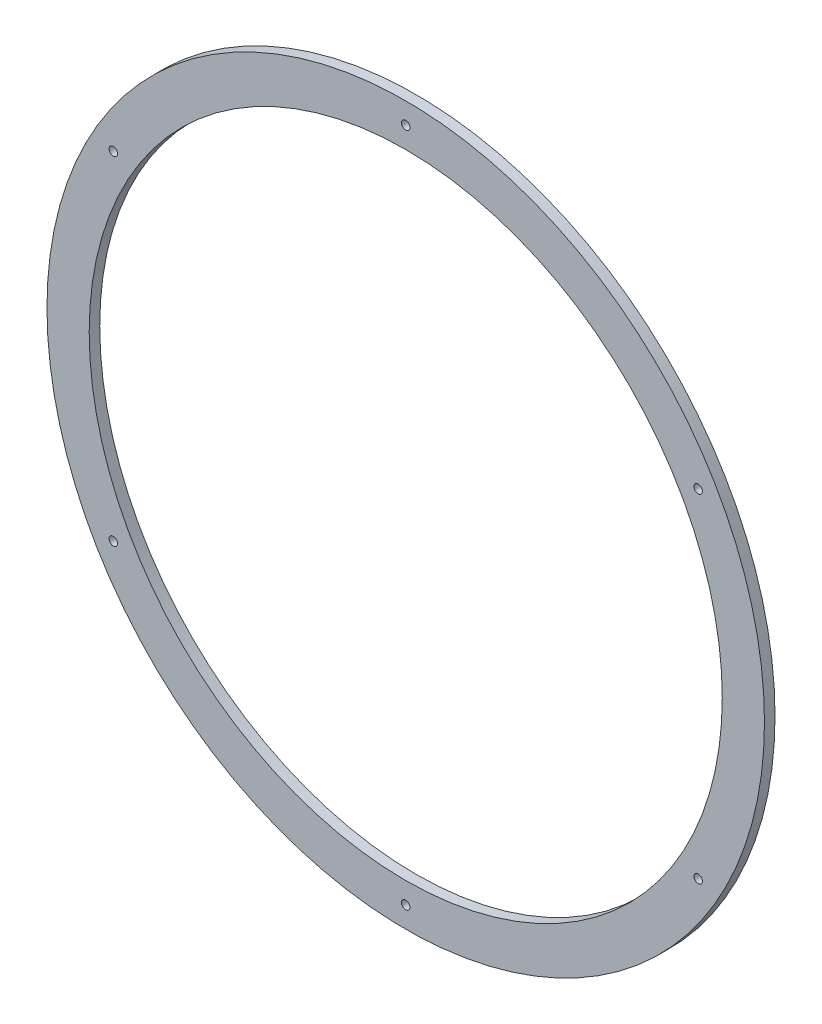
ISO-10303-21;
HEADER;
FILE_DESCRIPTION(('STEP AP214'),'2;1');
FILE_NAME('part.step','',(''),(''),'','','');
FILE_SCHEMA(('AUTOMOTIVE_DESIGN { 1 0 10303 214 1 1 1 1 }'));
ENDSEC;
DATA;
#1=APPLICATION_CONTEXT('core data for automotive mechanical design processes');
#2=APPLICATION_PROTOCOL_DEFINITION('international standard','automotive_design',2000,#1);
#3=PRODUCT_CONTEXT('',#1,'mechanical');
#4=PRODUCT('Part','Part','',(#3));
#5=PRODUCT_RELATED_PRODUCT_CATEGORY('part','',(#4));
#6=PRODUCT_DEFINITION_FORMATION('','',#4);
#7=PRODUCT_DEFINITION_CONTEXT('part definition',#1,'design');
#8=PRODUCT_DEFINITION('design','',#6,#7);
#9=PRODUCT_DEFINITION_SHAPE('','',#8);
#10=(LENGTH_UNIT() NAMED_UNIT(*) SI_UNIT(.MILLI.,.METRE.));
#11=(NAMED_UNIT(*) PLANE_ANGLE_UNIT() SI_UNIT($,.RADIAN.));
#12=(NAMED_UNIT(*) SI_UNIT($,.STERADIAN.) SOLID_ANGLE_UNIT());
#13=UNCERTAINTY_MEASURE_WITH_UNIT(LENGTH_MEASURE(1.E-05),#10,'distance_accuracy_value','');
#14=(GEOMETRIC_REPRESENTATION_CONTEXT(3) GLOBAL_UNCERTAINTY_ASSIGNED_CONTEXT((#13)) GLOBAL_UNIT_ASSIGNED_CONTEXT((#10,
#11,#12)) REPRESENTATION_CONTEXT('',''));
#15=CARTESIAN_POINT('',(0.,0.,0.));
#16=DIRECTION('',(0.,0.,1.));
#17=DIRECTION('',(1.,0.,0.));
#18=AXIS2_PLACEMENT_3D('',#15,#16,#17);
#19=CARTESIAN_POINT('',(0.,0.,5.));
#20=DIRECTION('',(0.,0.,1.));
#21=DIRECTION('',(1.,0.,0.));
#22=AXIS2_PLACEMENT_3D('',#19,#20,#21);
#23=PLANE('',#22);
#24=CARTESIAN_POINT('',(0.,160.,5.));
#25=DIRECTION('',(0.,0.,1.));
#26=DIRECTION('',(1.,0.,0.));
#27=AXIS2_PLACEMENT_3D('',#24,#25,#26);
#28=CIRCLE('',#27,2.);
#29=CARTESIAN_POINT('',(2.,160.,5.));
#30=VERTEX_POINT('',#29);
#31=EDGE_CURVE('E98',#30,#30,#28,.T.);
#32=ORIENTED_EDGE('',*,*,#31,.F.);
#33=EDGE_LOOP('',(#32));
#34=FACE_BOUND('',#33,.T.);
#35=CARTESIAN_POINT('',(-138.564064605511,-79.9999999999987,5.));
#36=DIRECTION('',(0.,0.,1.));
#37=DIRECTION('',(1.,0.,0.));
#38=AXIS2_PLACEMENT_3D('',#35,#36,#37);
#39=CIRCLE('',#38,2.00000000000003);
#40=CARTESIAN_POINT('',(-136.564064605511,-79.9999999999987,5.));
#41=VERTEX_POINT('',#40);
#42=EDGE_CURVE('E70',#41,#41,#39,.T.);
#43=ORIENTED_EDGE('',*,*,#42,.F.);
#44=EDGE_LOOP('',(#43));
#45=FACE_BOUND('',#44,.T.);
#46=CARTESIAN_POINT('',(-1.11849867522895E-12,-160.,5.));
#47=DIRECTION('',(0.,0.,1.));
#48=DIRECTION('',(1.,0.,0.));
#49=AXIS2_PLACEMENT_3D('',#46,#47,#48);
#50=CIRCLE('',#49,2.);
#51=CARTESIAN_POINT('',(1.99999999999889,-160.,5.));
#52=VERTEX_POINT('',#51);
#53=EDGE_CURVE('E69',#52,#52,#50,.T.);
#54=ORIENTED_EDGE('',*,*,#53,.F.);
#55=EDGE_LOOP('',(#54));
#56=FACE_BOUND('',#55,.T.);
#57=CARTESIAN_POINT('',(138.56406460551,-80.0000000000007,5.));
#58=DIRECTION('',(0.,0.,1.));
#59=DIRECTION('',(1.,0.,0.));
#60=AXIS2_PLACEMENT_3D('',#57,#58,#59);
#61=CIRCLE('',#60,2.00000000000001);
#62=CARTESIAN_POINT('',(140.56406460551,-80.0000000000007,5.));
#63=VERTEX_POINT('',#62);
#64=EDGE_CURVE('E78',#63,#63,#61,.T.);
#65=ORIENTED_EDGE('',*,*,#64,.F.);
#66=EDGE_LOOP('',(#65));
#67=FACE_BOUND('',#66,.T.);
#68=CARTESIAN_POINT('',(138.56406460551,79.9999999999997,5.));
#69=DIRECTION('',(0.,0.,1.));
#70=DIRECTION('',(1.,0.,0.));
#71=AXIS2_PLACEMENT_3D('',#68,#69,#70);
#72=CIRCLE('',#71,2.);
#73=CARTESIAN_POINT('',(140.56406460551,79.9999999999997,5.));
#74=VERTEX_POINT('',#73);
#75=EDGE_CURVE('E86',#74,#74,#72,.T.);
#76=ORIENTED_EDGE('',*,*,#75,.F.);
#77=EDGE_LOOP('',(#76));
#78=FACE_BOUND('',#77,.T.);
#79=CARTESIAN_POINT('',(-138.564064605509,80.0000000000016,5.));
#80=DIRECTION('',(0.,0.,1.));
#81=DIRECTION('',(1.,0.,0.));
#82=AXIS2_PLACEMENT_3D('',#79,#80,#81);
#83=CIRCLE('',#82,2.00000000000001);
#84=CARTESIAN_POINT('',(-136.564064605509,80.0000000000016,5.));
#85=VERTEX_POINT('',#84);
#86=EDGE_CURVE('E94',#85,#85,#83,.T.);
#87=ORIENTED_EDGE('',*,*,#86,.F.);
#88=EDGE_LOOP('',(#87));
#89=FACE_BOUND('',#88,.T.);
#90=CARTESIAN_POINT('',(0.,0.,5.));
#91=DIRECTION('',(0.,0.,1.));
#92=DIRECTION('',(1.,0.,0.));
#93=AXIS2_PLACEMENT_3D('',#90,#91,#92);
#94=CIRCLE('',#93,170.);
#95=CARTESIAN_POINT('',(170.,0.,5.));
#96=VERTEX_POINT('',#95);
#97=EDGE_CURVE('E10',#96,#96,#94,.T.);
#98=ORIENTED_EDGE('',*,*,#97,.T.);
#99=EDGE_LOOP('',(#98));
#100=FACE_BOUND('',#99,.T.);
#101=CARTESIAN_POINT('',(0.,0.,5.));
#102=DIRECTION('',(0.,0.,1.));
#103=DIRECTION('',(1.,0.,0.));
#104=AXIS2_PLACEMENT_3D('',#101,#102,#103);
#105=CIRCLE('',#104,150.);
#106=CARTESIAN_POINT('',(150.,0.,5.));
#107=VERTEX_POINT('',#106);
#108=EDGE_CURVE('E55',#107,#107,#105,.T.);
#109=ORIENTED_EDGE('',*,*,#108,.F.);
#110=EDGE_LOOP('',(#109));
#111=FACE_BOUND('',#110,.T.);
#112=ADVANCED_FACE('F42',(#34,#45,#56,#67,#78,#89,#100,#111),#23,.T.);
#113=CARTESIAN_POINT('',(0.,0.,0.));
#114=DIRECTION('',(0.,0.,1.));
#115=DIRECTION('',(1.,0.,0.));
#116=AXIS2_PLACEMENT_3D('',#113,#114,#115);
#117=PLANE('',#116);
#118=CARTESIAN_POINT('',(0.,160.,0.));
#119=DIRECTION('',(0.,0.,1.));
#120=DIRECTION('',(1.,0.,0.));
#121=AXIS2_PLACEMENT_3D('',#118,#119,#120);
#122=CIRCLE('',#121,2.);
#123=CARTESIAN_POINT('',(2.,160.,0.));
#124=VERTEX_POINT('',#123);
#125=EDGE_CURVE('E61',#124,#124,#122,.T.);
#126=ORIENTED_EDGE('',*,*,#125,.T.);
#127=EDGE_LOOP('',(#126));
#128=FACE_BOUND('',#127,.T.);
#129=CARTESIAN_POINT('',(-138.564064605511,-79.9999999999987,0.));
#130=DIRECTION('',(0.,0.,1.));
#131=DIRECTION('',(1.,0.,0.));
#132=AXIS2_PLACEMENT_3D('',#129,#130,#131);
#133=CIRCLE('',#132,2.00000000000003);
#134=CARTESIAN_POINT('',(-136.564064605511,-79.9999999999987,0.));
#135=VERTEX_POINT('',#134);
#136=EDGE_CURVE('E99',#135,#135,#133,.T.);
#137=ORIENTED_EDGE('',*,*,#136,.T.);
#138=EDGE_LOOP('',(#137));
#139=FACE_BOUND('',#138,.T.);
#140=CARTESIAN_POINT('',(-1.11849867522895E-12,-160.,0.));
#141=DIRECTION('',(0.,0.,1.));
#142=DIRECTION('',(1.,0.,0.));
#143=AXIS2_PLACEMENT_3D('',#140,#141,#142);
#144=CIRCLE('',#143,2.);
#145=CARTESIAN_POINT('',(1.99999999999889,-160.,0.));
#146=VERTEX_POINT('',#145);
#147=EDGE_CURVE('E65',#146,#146,#144,.T.);
#148=ORIENTED_EDGE('',*,*,#147,.T.);
#149=EDGE_LOOP('',(#148));
#150=FACE_BOUND('',#149,.T.);
#151=CARTESIAN_POINT('',(138.56406460551,-80.0000000000007,0.));
#152=DIRECTION('',(0.,0.,1.));
#153=DIRECTION('',(1.,0.,0.));
#154=AXIS2_PLACEMENT_3D('',#151,#152,#153);
#155=CIRCLE('',#154,2.00000000000001);
#156=CARTESIAN_POINT('',(140.56406460551,-80.0000000000007,0.));
#157=VERTEX_POINT('',#156);
#158=EDGE_CURVE('E74',#157,#157,#155,.T.);
#159=ORIENTED_EDGE('',*,*,#158,.T.);
#160=EDGE_LOOP('',(#159));
#161=FACE_BOUND('',#160,.T.);
#162=CARTESIAN_POINT('',(138.56406460551,79.9999999999997,0.));
#163=DIRECTION('',(0.,0.,1.));
#164=DIRECTION('',(1.,0.,0.));
#165=AXIS2_PLACEMENT_3D('',#162,#163,#164);
#166=CIRCLE('',#165,2.);
#167=CARTESIAN_POINT('',(140.56406460551,79.9999999999997,0.));
#168=VERTEX_POINT('',#167);
#169=EDGE_CURVE('E82',#168,#168,#166,.T.);
#170=ORIENTED_EDGE('',*,*,#169,.T.);
#171=EDGE_LOOP('',(#170));
#172=FACE_BOUND('',#171,.T.);
#173=CARTESIAN_POINT('',(-138.564064605509,80.0000000000016,0.));
#174=DIRECTION('',(0.,0.,1.));
#175=DIRECTION('',(1.,0.,0.));
#176=AXIS2_PLACEMENT_3D('',#173,#174,#175);
#177=CIRCLE('',#176,2.00000000000001);
#178=CARTESIAN_POINT('',(-136.564064605509,80.0000000000016,0.));
#179=VERTEX_POINT('',#178);
#180=EDGE_CURVE('E90',#179,#179,#177,.T.);
#181=ORIENTED_EDGE('',*,*,#180,.T.);
#182=EDGE_LOOP('',(#181));
#183=FACE_BOUND('',#182,.T.);
#184=CARTESIAN_POINT('',(0.,0.,0.));
#185=DIRECTION('',(0.,0.,1.));
#186=DIRECTION('',(1.,0.,0.));
#187=AXIS2_PLACEMENT_3D('',#184,#185,#186);
#188=CIRCLE('',#187,170.);
#189=CARTESIAN_POINT('',(170.,0.,0.));
#190=VERTEX_POINT('',#189);
#191=EDGE_CURVE('E46',#190,#190,#188,.T.);
#192=ORIENTED_EDGE('',*,*,#191,.F.);
#193=EDGE_LOOP('',(#192));
#194=FACE_BOUND('',#193,.T.);
#195=CARTESIAN_POINT('',(0.,0.,0.));
#196=DIRECTION('',(0.,0.,1.));
#197=DIRECTION('',(1.,0.,0.));
#198=AXIS2_PLACEMENT_3D('',#195,#196,#197);
#199=CIRCLE('',#198,150.);
#200=CARTESIAN_POINT('',(150.,0.,0.));
#201=VERTEX_POINT('',#200);
#202=EDGE_CURVE('E57',#201,#201,#199,.T.);
#203=ORIENTED_EDGE('',*,*,#202,.T.);
#204=EDGE_LOOP('',(#203));
#205=FACE_BOUND('',#204,.T.);
#206=ADVANCED_FACE('F113',(#128,#139,#150,#161,#172,#183,#194,#205),#117,.F.);
#207=CARTESIAN_POINT('',(0.,0.,5.));
#208=DIRECTION('',(0.,0.,-1.));
#209=DIRECTION('',(-1.,0.,0.));
#210=AXIS2_PLACEMENT_3D('',#207,#208,#209);
#211=CYLINDRICAL_SURFACE('',#210,170.);
#212=ORIENTED_EDGE('',*,*,#97,.F.);
#213=EDGE_LOOP('',(#212));
#214=FACE_BOUND('',#213,.T.);
#215=ORIENTED_EDGE('',*,*,#191,.T.);
#216=EDGE_LOOP('',(#215));
#217=FACE_BOUND('',#216,.T.);
#218=ADVANCED_FACE('F44',(#214,#217),#211,.T.);
#219=CARTESIAN_POINT('',(0.,0.,5.));
#220=DIRECTION('',(0.,0.,-1.));
#221=DIRECTION('',(-1.,0.,0.));
#222=AXIS2_PLACEMENT_3D('',#219,#220,#221);
#223=CYLINDRICAL_SURFACE('',#222,150.);
#224=ORIENTED_EDGE('',*,*,#108,.T.);
#225=EDGE_LOOP('',(#224));
#226=FACE_BOUND('',#225,.T.);
#227=ORIENTED_EDGE('',*,*,#202,.F.);
#228=EDGE_LOOP('',(#227));
#229=FACE_BOUND('',#228,.T.);
#230=ADVANCED_FACE('F138',(#226,#229),#223,.F.);
#231=CARTESIAN_POINT('',(-138.564064605509,80.0000000000016,0.));
#232=DIRECTION('',(0.,0.,1.));
#233=DIRECTION('',(1.,0.,0.));
#234=AXIS2_PLACEMENT_3D('',#231,#232,#233);
#235=CYLINDRICAL_SURFACE('',#234,2.00000000000001);
#236=ORIENTED_EDGE('',*,*,#180,.F.);
#237=EDGE_LOOP('',(#236));
#238=FACE_BOUND('',#237,.T.);
#239=ORIENTED_EDGE('',*,*,#86,.T.);
#240=EDGE_LOOP('',(#239));
#241=FACE_BOUND('',#240,.T.);
#242=ADVANCED_FACE('F141',(#238,#241),#235,.F.);
#243=CARTESIAN_POINT('',(138.56406460551,79.9999999999997,0.));
#244=DIRECTION('',(0.,0.,1.));
#245=DIRECTION('',(1.,0.,0.));
#246=AXIS2_PLACEMENT_3D('',#243,#244,#245);
#247=CYLINDRICAL_SURFACE('',#246,2.);
#248=ORIENTED_EDGE('',*,*,#169,.F.);
#249=EDGE_LOOP('',(#248));
#250=FACE_BOUND('',#249,.T.);
#251=ORIENTED_EDGE('',*,*,#75,.T.);
#252=EDGE_LOOP('',(#251));
#253=FACE_BOUND('',#252,.T.);
#254=ADVANCED_FACE('F159',(#250,#253),#247,.F.);
#255=CARTESIAN_POINT('',(138.56406460551,-80.0000000000007,0.));
#256=DIRECTION('',(0.,0.,1.));
#257=DIRECTION('',(1.,0.,0.));
#258=AXIS2_PLACEMENT_3D('',#255,#256,#257);
#259=CYLINDRICAL_SURFACE('',#258,2.00000000000001);
#260=ORIENTED_EDGE('',*,*,#158,.F.);
#261=EDGE_LOOP('',(#260));
#262=FACE_BOUND('',#261,.T.);
#263=ORIENTED_EDGE('',*,*,#64,.T.);
#264=EDGE_LOOP('',(#263));
#265=FACE_BOUND('',#264,.T.);
#266=ADVANCED_FACE('F155',(#262,#265),#259,.F.);
#267=CARTESIAN_POINT('',(-1.11849867522895E-12,-160.,0.));
#268=DIRECTION('',(0.,0.,1.));
#269=DIRECTION('',(1.,0.,0.));
#270=AXIS2_PLACEMENT_3D('',#267,#268,#269);
#271=CYLINDRICAL_SURFACE('',#270,2.);
#272=ORIENTED_EDGE('',*,*,#147,.F.);
#273=EDGE_LOOP('',(#272));
#274=FACE_BOUND('',#273,.T.);
#275=ORIENTED_EDGE('',*,*,#53,.T.);
#276=EDGE_LOOP('',(#275));
#277=FACE_BOUND('',#276,.T.);
#278=ADVANCED_FACE('F152',(#274,#277),#271,.F.);
#279=CARTESIAN_POINT('',(-138.564064605511,-79.9999999999987,0.));
#280=DIRECTION('',(0.,0.,1.));
#281=DIRECTION('',(1.,0.,0.));
#282=AXIS2_PLACEMENT_3D('',#279,#280,#281);
#283=CYLINDRICAL_SURFACE('',#282,2.00000000000003);
#284=ORIENTED_EDGE('',*,*,#136,.F.);
#285=EDGE_LOOP('',(#284));
#286=FACE_BOUND('',#285,.T.);
#287=ORIENTED_EDGE('',*,*,#42,.T.);
#288=EDGE_LOOP('',(#287));
#289=FACE_BOUND('',#288,.T.);
#290=ADVANCED_FACE('F119',(#286,#289),#283,.F.);
#291=CARTESIAN_POINT('',(0.,160.,0.));
#292=DIRECTION('',(0.,0.,1.));
#293=DIRECTION('',(1.,0.,0.));
#294=AXIS2_PLACEMENT_3D('',#291,#292,#293);
#295=CYLINDRICAL_SURFACE('',#294,2.);
#296=ORIENTED_EDGE('',*,*,#125,.F.);
#297=EDGE_LOOP('',(#296));
#298=FACE_BOUND('',#297,.T.);
#299=ORIENTED_EDGE('',*,*,#31,.T.);
#300=EDGE_LOOP('',(#299));
#301=FACE_BOUND('',#300,.T.);
#302=ADVANCED_FACE('F116',(#298,#301),#295,.F.);
#303=CLOSED_SHELL('',(#112,#206,#218,#230,#242,#254,#266,#278,#290,#302));
#304=MANIFOLD_SOLID_BREP('B2',#303);
#305=ADVANCED_BREP_SHAPE_REPRESENTATION('',(#18,#304),#14);
#306=SHAPE_DEFINITION_REPRESENTATION(#9,#305);
ENDSEC;
END-ISO-10303-21;
